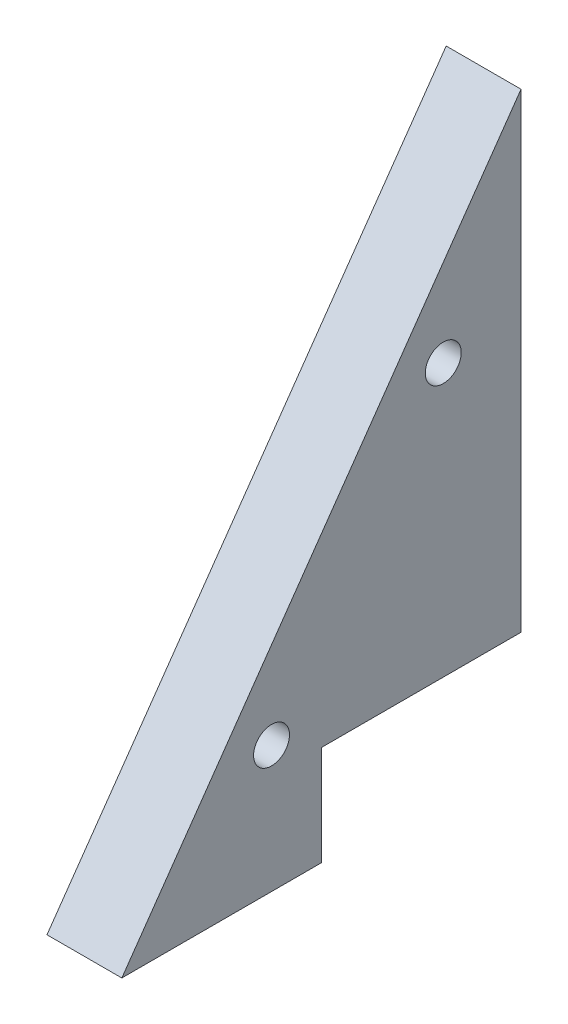
ISO-10303-21;
HEADER;
FILE_DESCRIPTION(('STEP AP214'),'2;1');
FILE_NAME('part.step','',(''),(''),'','','');
FILE_SCHEMA(('AUTOMOTIVE_DESIGN { 1 0 10303 214 1 1 1 1 }'));
ENDSEC;
DATA;
#1=APPLICATION_CONTEXT('core data for automotive mechanical design processes');
#2=APPLICATION_PROTOCOL_DEFINITION('international standard','automotive_design',2000,#1);
#3=PRODUCT_CONTEXT('',#1,'mechanical');
#4=PRODUCT('Part','Part','',(#3));
#5=PRODUCT_RELATED_PRODUCT_CATEGORY('part','',(#4));
#6=PRODUCT_DEFINITION_FORMATION('','',#4);
#7=PRODUCT_DEFINITION_CONTEXT('part definition',#1,'design');
#8=PRODUCT_DEFINITION('design','',#6,#7);
#9=PRODUCT_DEFINITION_SHAPE('','',#8);
#10=(LENGTH_UNIT() NAMED_UNIT(*) SI_UNIT(.MILLI.,.METRE.));
#11=(NAMED_UNIT(*) PLANE_ANGLE_UNIT() SI_UNIT($,.RADIAN.));
#12=(NAMED_UNIT(*) SI_UNIT($,.STERADIAN.) SOLID_ANGLE_UNIT());
#13=UNCERTAINTY_MEASURE_WITH_UNIT(LENGTH_MEASURE(1.E-05),#10,'distance_accuracy_value','');
#14=(GEOMETRIC_REPRESENTATION_CONTEXT(3) GLOBAL_UNCERTAINTY_ASSIGNED_CONTEXT((#13)) GLOBAL_UNIT_ASSIGNED_CONTEXT((#10,
#11,#12)) REPRESENTATION_CONTEXT('',''));
#15=CARTESIAN_POINT('',(0.,0.,0.));
#16=DIRECTION('',(0.,0.,1.));
#17=DIRECTION('',(1.,0.,0.));
#18=AXIS2_PLACEMENT_3D('',#15,#16,#17);
#19=CARTESIAN_POINT('',(9.525,12.7,0.));
#20=DIRECTION('',(0.,0.,1.));
#21=DIRECTION('',(1.,0.,0.));
#22=AXIS2_PLACEMENT_3D('',#19,#20,#21);
#23=PLANE('',#22);
#24=DIRECTION('',(0.,1.,0.));
#25=VECTOR('',#24,1.);
#26=CARTESIAN_POINT('',(0.,12.7,0.));
#27=LINE('',#26,#25);
#28=CARTESIAN_POINT('',(0.,0.,0.));
#29=VERTEX_POINT('',#28);
#30=CARTESIAN_POINT('',(0.,12.7,0.));
#31=VERTEX_POINT('',#30);
#32=EDGE_CURVE('E123',#29,#31,#27,.T.);
#33=ORIENTED_EDGE('',*,*,#32,.T.);
#34=DIRECTION('',(-1.,0.,0.));
#35=VECTOR('',#34,1.);
#36=CARTESIAN_POINT('',(9.525,12.7,0.));
#37=LINE('',#36,#35);
#38=CARTESIAN_POINT('',(9.525,12.7,0.));
#39=VERTEX_POINT('',#38);
#40=EDGE_CURVE('E11',#39,#31,#37,.T.);
#41=ORIENTED_EDGE('',*,*,#40,.F.);
#42=DIRECTION('',(0.,1.,0.));
#43=VECTOR('',#42,1.);
#44=CARTESIAN_POINT('',(9.525,12.7,0.));
#45=LINE('',#44,#43);
#46=CARTESIAN_POINT('',(9.525,0.,0.));
#47=VERTEX_POINT('',#46);
#48=EDGE_CURVE('E137',#47,#39,#45,.T.);
#49=ORIENTED_EDGE('',*,*,#48,.F.);
#50=DIRECTION('',(-1.,0.,0.));
#51=VECTOR('',#50,1.);
#52=CARTESIAN_POINT('',(9.525,0.,0.));
#53=LINE('',#52,#51);
#54=EDGE_CURVE('E119',#47,#29,#53,.T.);
#55=ORIENTED_EDGE('',*,*,#54,.T.);
#56=EDGE_LOOP('',(#33,#41,#49,#55));
#57=FACE_BOUND('',#56,.T.);
#58=ADVANCED_FACE('F44',(#57),#23,.F.);
#59=CARTESIAN_POINT('',(9.525,12.7,-25.4));
#60=DIRECTION('',(0.,1.,0.));
#61=DIRECTION('',(0.,0.,1.));
#62=AXIS2_PLACEMENT_3D('',#59,#60,#61);
#63=PLANE('',#62);
#64=CARTESIAN_POINT('',(4.7625,12.7,-19.05));
#65=DIRECTION('',(0.,-1.,0.));
#66=DIRECTION('',(0.,0.,-1.));
#67=AXIS2_PLACEMENT_3D('',#64,#65,#66);
#68=CIRCLE('',#67,1.905);
#69=CARTESIAN_POINT('',(4.7625,12.7,-20.955));
#70=VERTEX_POINT('',#69);
#71=EDGE_CURVE('E173',#70,#70,#68,.T.);
#72=ORIENTED_EDGE('',*,*,#71,.F.);
#73=EDGE_LOOP('',(#72));
#74=FACE_BOUND('',#73,.T.);
#75=CARTESIAN_POINT('',(4.7625,12.7,-6.35));
#76=DIRECTION('',(0.,-1.,0.));
#77=DIRECTION('',(0.,0.,-1.));
#78=AXIS2_PLACEMENT_3D('',#75,#76,#77);
#79=CIRCLE('',#78,1.905);
#80=CARTESIAN_POINT('',(4.7625,12.7,-8.255));
#81=VERTEX_POINT('',#80);
#82=EDGE_CURVE('E176',#81,#81,#79,.T.);
#83=ORIENTED_EDGE('',*,*,#82,.F.);
#84=EDGE_LOOP('',(#83));
#85=FACE_BOUND('',#84,.T.);
#86=DIRECTION('',(0.,0.,-1.));
#87=VECTOR('',#86,1.);
#88=CARTESIAN_POINT('',(0.,12.7,-25.4));
#89=LINE('',#88,#87);
#90=CARTESIAN_POINT('',(0.,12.7,-25.4));
#91=VERTEX_POINT('',#90);
#92=EDGE_CURVE('E127',#31,#91,#89,.T.);
#93=ORIENTED_EDGE('',*,*,#92,.T.);
#94=DIRECTION('',(-1.,0.,0.));
#95=VECTOR('',#94,1.);
#96=CARTESIAN_POINT('',(9.525,12.7,-25.4));
#97=LINE('',#96,#95);
#98=CARTESIAN_POINT('',(9.525,12.7,-25.4));
#99=VERTEX_POINT('',#98);
#100=EDGE_CURVE('E53',#99,#91,#97,.T.);
#101=ORIENTED_EDGE('',*,*,#100,.F.);
#102=DIRECTION('',(0.,0.,-1.));
#103=VECTOR('',#102,1.);
#104=CARTESIAN_POINT('',(9.525,12.7,-25.4));
#105=LINE('',#104,#103);
#106=EDGE_CURVE('E95',#39,#99,#105,.T.);
#107=ORIENTED_EDGE('',*,*,#106,.F.);
#108=ORIENTED_EDGE('',*,*,#40,.T.);
#109=EDGE_LOOP('',(#93,#101,#107,#108));
#110=FACE_BOUND('',#109,.T.);
#111=ADVANCED_FACE('F161',(#74,#85,#110),#63,.F.);
#112=CARTESIAN_POINT('',(9.525,72.5499187424986,-25.4));
#113=DIRECTION('',(0.,0.,1.));
#114=DIRECTION('',(0.,-1.,0.));
#115=AXIS2_PLACEMENT_3D('',#112,#113,#114);
#116=PLANE('',#115);
#117=DIRECTION('',(0.,1.,0.));
#118=VECTOR('',#117,1.);
#119=CARTESIAN_POINT('',(0.,72.5499187424986,-25.4));
#120=LINE('',#119,#118);
#121=CARTESIAN_POINT('',(0.,72.5499187424986,-25.4));
#122=VERTEX_POINT('',#121);
#123=EDGE_CURVE('E111',#91,#122,#120,.T.);
#124=ORIENTED_EDGE('',*,*,#123,.T.);
#125=DIRECTION('',(-1.,0.,0.));
#126=VECTOR('',#125,1.);
#127=CARTESIAN_POINT('',(9.525,72.5499187424986,-25.4));
#128=LINE('',#127,#126);
#129=CARTESIAN_POINT('',(9.525,72.5499187424986,-25.4));
#130=VERTEX_POINT('',#129);
#131=EDGE_CURVE('E108',#130,#122,#128,.T.);
#132=ORIENTED_EDGE('',*,*,#131,.F.);
#133=DIRECTION('',(0.,1.,0.));
#134=VECTOR('',#133,1.);
#135=CARTESIAN_POINT('',(9.525,72.5499187424986,-25.4));
#136=LINE('',#135,#134);
#137=EDGE_CURVE('E99',#99,#130,#136,.T.);
#138=ORIENTED_EDGE('',*,*,#137,.F.);
#139=ORIENTED_EDGE('',*,*,#100,.T.);
#140=EDGE_LOOP('',(#124,#132,#138,#139));
#141=FACE_BOUND('',#140,.T.);
#142=ADVANCED_FACE('F109',(#141),#116,.F.);
#143=CARTESIAN_POINT('',(9.525,0.,25.4));
#144=DIRECTION('',(0.,-0.57357643635105,-0.819152044288989));
#145=DIRECTION('',(0.,0.819152044288989,-0.57357643635105));
#146=AXIS2_PLACEMENT_3D('',#143,#144,#145);
#147=PLANE('',#146);
#148=DIRECTION('',(0.,-0.819152044288989,0.57357643635105));
#149=VECTOR('',#148,1.);
#150=CARTESIAN_POINT('',(0.,0.,25.4));
#151=LINE('',#150,#149);
#152=CARTESIAN_POINT('',(0.,0.,25.4));
#153=VERTEX_POINT('',#152);
#154=EDGE_CURVE('E81',#122,#153,#151,.T.);
#155=ORIENTED_EDGE('',*,*,#154,.T.);
#156=DIRECTION('',(-1.,0.,0.));
#157=VECTOR('',#156,1.);
#158=CARTESIAN_POINT('',(9.525,0.,25.4));
#159=LINE('',#158,#157);
#160=CARTESIAN_POINT('',(9.525,0.,25.4));
#161=VERTEX_POINT('',#160);
#162=EDGE_CURVE('E113',#161,#153,#159,.T.);
#163=ORIENTED_EDGE('',*,*,#162,.F.);
#164=DIRECTION('',(0.,-0.819152044288989,0.57357643635105));
#165=VECTOR('',#164,1.);
#166=CARTESIAN_POINT('',(9.525,0.,25.4));
#167=LINE('',#166,#165);
#168=EDGE_CURVE('E103',#130,#161,#167,.T.);
#169=ORIENTED_EDGE('',*,*,#168,.F.);
#170=ORIENTED_EDGE('',*,*,#131,.T.);
#171=EDGE_LOOP('',(#155,#163,#169,#170));
#172=FACE_BOUND('',#171,.T.);
#173=ADVANCED_FACE('F115',(#172),#147,.F.);
#174=CARTESIAN_POINT('',(9.525,0.,0.));
#175=DIRECTION('',(0.,1.,0.));
#176=DIRECTION('',(0.,0.,1.));
#177=AXIS2_PLACEMENT_3D('',#174,#175,#176);
#178=PLANE('',#177);
#179=DIRECTION('',(0.,0.,-1.));
#180=VECTOR('',#179,1.);
#181=CARTESIAN_POINT('',(0.,0.,0.));
#182=LINE('',#181,#180);
#183=EDGE_CURVE('E87',#153,#29,#182,.T.);
#184=ORIENTED_EDGE('',*,*,#183,.T.);
#185=ORIENTED_EDGE('',*,*,#54,.F.);
#186=DIRECTION('',(0.,0.,-1.));
#187=VECTOR('',#186,1.);
#188=CARTESIAN_POINT('',(9.525,0.,0.));
#189=LINE('',#188,#187);
#190=EDGE_CURVE('E61',#161,#47,#189,.T.);
#191=ORIENTED_EDGE('',*,*,#190,.F.);
#192=ORIENTED_EDGE('',*,*,#162,.T.);
#193=EDGE_LOOP('',(#184,#185,#191,#192));
#194=FACE_BOUND('',#193,.T.);
#195=ADVANCED_FACE('F148',(#194),#178,.F.);
#196=CARTESIAN_POINT('',(9.525,0.,0.));
#197=DIRECTION('',(-1.,0.,0.));
#198=DIRECTION('',(0.,0.,1.));
#199=AXIS2_PLACEMENT_3D('',#196,#197,#198);
#200=PLANE('',#199);
#201=CARTESIAN_POINT('',(9.525,16.1353323762431,6.35));
#202=DIRECTION('',(1.,0.,0.));
#203=DIRECTION('',(0.,0.,-1.));
#204=AXIS2_PLACEMENT_3D('',#201,#202,#203);
#205=CIRCLE('',#204,2.286);
#206=CARTESIAN_POINT('',(9.525,16.1353323762431,4.064));
#207=VERTEX_POINT('',#206);
#208=EDGE_CURVE('E204',#207,#207,#205,.T.);
#209=ORIENTED_EDGE('',*,*,#208,.F.);
#210=EDGE_LOOP('',(#209));
#211=FACE_BOUND('',#210,.T.);
#212=CARTESIAN_POINT('',(9.525,47.3450252636536,-15.503262224975));
#213=DIRECTION('',(1.,0.,0.));
#214=DIRECTION('',(0.,0.,-1.));
#215=AXIS2_PLACEMENT_3D('',#212,#213,#214);
#216=CIRCLE('',#215,2.286);
#217=CARTESIAN_POINT('',(9.525,47.3450252636536,-17.789262224975));
#218=VERTEX_POINT('',#217);
#219=EDGE_CURVE('E200',#218,#218,#216,.T.);
#220=ORIENTED_EDGE('',*,*,#219,.F.);
#221=EDGE_LOOP('',(#220));
#222=FACE_BOUND('',#221,.T.);
#223=ORIENTED_EDGE('',*,*,#48,.T.);
#224=ORIENTED_EDGE('',*,*,#106,.T.);
#225=ORIENTED_EDGE('',*,*,#137,.T.);
#226=ORIENTED_EDGE('',*,*,#168,.T.);
#227=ORIENTED_EDGE('',*,*,#190,.T.);
#228=EDGE_LOOP('',(#223,#224,#225,#226,#227));
#229=FACE_BOUND('',#228,.T.);
#230=ADVANCED_FACE('F101',(#211,#222,#229),#200,.F.);
#231=CARTESIAN_POINT('',(0.,0.,0.));
#232=DIRECTION('',(-1.,0.,0.));
#233=DIRECTION('',(0.,0.,1.));
#234=AXIS2_PLACEMENT_3D('',#231,#232,#233);
#235=PLANE('',#234);
#236=CARTESIAN_POINT('',(0.,16.1353323762431,6.35));
#237=DIRECTION('',(1.,0.,0.));
#238=DIRECTION('',(0.,0.,-1.));
#239=AXIS2_PLACEMENT_3D('',#236,#237,#238);
#240=CIRCLE('',#239,2.286);
#241=CARTESIAN_POINT('',(0.,16.1353323762431,4.064));
#242=VERTEX_POINT('',#241);
#243=EDGE_CURVE('E185',#242,#242,#240,.T.);
#244=ORIENTED_EDGE('',*,*,#243,.T.);
#245=EDGE_LOOP('',(#244));
#246=FACE_BOUND('',#245,.T.);
#247=CARTESIAN_POINT('',(0.,47.3450252636536,-15.503262224975));
#248=DIRECTION('',(1.,0.,0.));
#249=DIRECTION('',(0.,0.,-1.));
#250=AXIS2_PLACEMENT_3D('',#247,#248,#249);
#251=CIRCLE('',#250,2.286);
#252=CARTESIAN_POINT('',(0.,47.3450252636536,-17.789262224975));
#253=VERTEX_POINT('',#252);
#254=EDGE_CURVE('E196',#253,#253,#251,.T.);
#255=ORIENTED_EDGE('',*,*,#254,.T.);
#256=EDGE_LOOP('',(#255));
#257=FACE_BOUND('',#256,.T.);
#258=ORIENTED_EDGE('',*,*,#32,.F.);
#259=ORIENTED_EDGE('',*,*,#183,.F.);
#260=ORIENTED_EDGE('',*,*,#154,.F.);
#261=ORIENTED_EDGE('',*,*,#123,.F.);
#262=ORIENTED_EDGE('',*,*,#92,.F.);
#263=EDGE_LOOP('',(#258,#259,#260,#261,#262));
#264=FACE_BOUND('',#263,.T.);
#265=ADVANCED_FACE('F144',(#246,#257,#264),#235,.T.);
#266=CARTESIAN_POINT('',(4.7625,22.225,-6.35));
#267=DIRECTION('',(0.,-1.,0.));
#268=DIRECTION('',(0.,0.,-1.));
#269=AXIS2_PLACEMENT_3D('',#266,#267,#268);
#270=CYLINDRICAL_SURFACE('',#269,1.905);
#271=CARTESIAN_POINT('',(4.7625,22.225,-6.35));
#272=DIRECTION('',(0.,-1.,0.));
#273=DIRECTION('',(0.,0.,-1.));
#274=AXIS2_PLACEMENT_3D('',#271,#272,#273);
#275=CIRCLE('',#274,1.905);
#276=CARTESIAN_POINT('',(4.7625,22.225,-8.255));
#277=VERTEX_POINT('',#276);
#278=EDGE_CURVE('E179',#277,#277,#275,.T.);
#279=CARTESIAN_POINT('',(4.7625,22.225,-8.255));
#280=CARTESIAN_POINT('',(4.7625,22.12578125,-8.255));
#281=CARTESIAN_POINT('',(4.7625,22.0265625,-8.255));
#282=CARTESIAN_POINT('',(4.7625,21.828125,-8.255));
#283=CARTESIAN_POINT('',(4.7625,21.72890625,-8.255));
#284=CARTESIAN_POINT('',(4.7625,21.53046875,-8.255));
#285=CARTESIAN_POINT('',(4.7625,21.43125,-8.255));
#286=CARTESIAN_POINT('',(4.7625,21.2328125,-8.255));
#287=CARTESIAN_POINT('',(4.7625,21.13359375,-8.255));
#288=CARTESIAN_POINT('',(4.7625,20.93515625,-8.255));
#289=CARTESIAN_POINT('',(4.7625,20.8359375,-8.255));
#290=CARTESIAN_POINT('',(4.7625,20.6375,-8.255));
#291=CARTESIAN_POINT('',(4.7625,20.53828125,-8.255));
#292=CARTESIAN_POINT('',(4.7625,20.33984375,-8.255));
#293=CARTESIAN_POINT('',(4.7625,20.240625,-8.255));
#294=CARTESIAN_POINT('',(4.7625,20.0421875,-8.255));
#295=CARTESIAN_POINT('',(4.7625,19.94296875,-8.255));
#296=CARTESIAN_POINT('',(4.7625,19.74453125,-8.255));
#297=CARTESIAN_POINT('',(4.7625,19.6453125,-8.255));
#298=CARTESIAN_POINT('',(4.7625,19.446875,-8.255));
#299=CARTESIAN_POINT('',(4.7625,19.34765625,-8.255));
#300=CARTESIAN_POINT('',(4.7625,19.14921875,-8.255));
#301=CARTESIAN_POINT('',(4.7625,19.05,-8.255));
#302=CARTESIAN_POINT('',(4.7625,18.8515625,-8.255));
#303=CARTESIAN_POINT('',(4.7625,18.75234375,-8.255));
#304=CARTESIAN_POINT('',(4.7625,18.55390625,-8.255));
#305=CARTESIAN_POINT('',(4.7625,18.4546875,-8.255));
#306=CARTESIAN_POINT('',(4.7625,18.25625,-8.255));
#307=CARTESIAN_POINT('',(4.7625,18.15703125,-8.255));
#308=CARTESIAN_POINT('',(4.7625,17.95859375,-8.255));
#309=CARTESIAN_POINT('',(4.7625,17.859375,-8.255));
#310=CARTESIAN_POINT('',(4.7625,17.6609375,-8.255));
#311=CARTESIAN_POINT('',(4.7625,17.56171875,-8.255));
#312=CARTESIAN_POINT('',(4.7625,17.36328125,-8.255));
#313=CARTESIAN_POINT('',(4.7625,17.2640625,-8.255));
#314=CARTESIAN_POINT('',(4.7625,17.065625,-8.255));
#315=CARTESIAN_POINT('',(4.7625,16.96640625,-8.255));
#316=CARTESIAN_POINT('',(4.7625,16.76796875,-8.255));
#317=CARTESIAN_POINT('',(4.7625,16.66875,-8.255));
#318=CARTESIAN_POINT('',(4.7625,16.4703125,-8.255));
#319=CARTESIAN_POINT('',(4.7625,16.37109375,-8.255));
#320=CARTESIAN_POINT('',(4.7625,16.17265625,-8.255));
#321=CARTESIAN_POINT('',(4.7625,16.0734375,-8.255));
#322=CARTESIAN_POINT('',(4.7625,15.875,-8.255));
#323=CARTESIAN_POINT('',(4.7625,15.77578125,-8.255));
#324=CARTESIAN_POINT('',(4.7625,15.57734375,-8.255));
#325=CARTESIAN_POINT('',(4.7625,15.478125,-8.255));
#326=CARTESIAN_POINT('',(4.7625,15.2796875,-8.255));
#327=CARTESIAN_POINT('',(4.7625,15.18046875,-8.255));
#328=CARTESIAN_POINT('',(4.7625,14.98203125,-8.255));
#329=CARTESIAN_POINT('',(4.7625,14.8828125,-8.255));
#330=CARTESIAN_POINT('',(4.7625,14.684375,-8.255));
#331=CARTESIAN_POINT('',(4.7625,14.58515625,-8.255));
#332=CARTESIAN_POINT('',(4.7625,14.38671875,-8.255));
#333=CARTESIAN_POINT('',(4.7625,14.2875,-8.255));
#334=CARTESIAN_POINT('',(4.7625,14.0890625,-8.255));
#335=CARTESIAN_POINT('',(4.7625,13.98984375,-8.255));
#336=CARTESIAN_POINT('',(4.7625,13.79140625,-8.255));
#337=CARTESIAN_POINT('',(4.7625,13.6921875,-8.255));
#338=CARTESIAN_POINT('',(4.7625,13.49375,-8.255));
#339=CARTESIAN_POINT('',(4.7625,13.39453125,-8.255));
#340=CARTESIAN_POINT('',(4.7625,13.19609375,-8.255));
#341=CARTESIAN_POINT('',(4.7625,13.096875,-8.255));
#342=CARTESIAN_POINT('',(4.7625,12.8984375,-8.255));
#343=CARTESIAN_POINT('',(4.7625,12.79921875,-8.255));
#344=CARTESIAN_POINT('',(4.7625,12.7,-8.255));
#345=B_SPLINE_CURVE_WITH_KNOTS('',3,(#279,#280,#281,#282,#283,#284,#285,#286,#287,#288,#289,
#290,#291,#292,#293,#294,#295,#296,#297,#298,#299,#300,#301,#302,#303,#304,#305,#306,#307,#308,
#309,#310,#311,#312,#313,#314,#315,#316,#317,#318,#319,#320,#321,#322,#323,#324,#325,#326,#327,
#328,#329,#330,#331,#332,#333,#334,#335,#336,#337,#338,#339,#340,#341,#342,#343,#344),
.UNSPECIFIED.,.F.,.F.,(4,2,2,2,2,2,2,2,2,2,2,2,2,2,2,2,2,2,2,2,2,2,2,2,2,2,2,2,2,2,2,2,4),(0.,
0.29765625,0.5953125,0.892968750000001,1.190625,1.48828125,1.7859375,2.08359375,2.38125,
2.67890625,2.9765625,3.27421875,3.571875,3.86953125,4.1671875,4.46484375,4.7625,5.06015625,
5.3578125,5.65546875,5.953125,6.25078125,6.5484375,6.84609375,7.14375,7.44140625,7.7390625,
8.03671875,8.334375,8.63203125,8.9296875,9.22734375,9.525),.UNSPECIFIED.);
#346=EDGE_CURVE('BSEAM239',#277,#81,#345,.T.);
#347=ORIENTED_EDGE('',*,*,#278,.F.);
#348=ORIENTED_EDGE('',*,*,#82,.T.);
#349=ORIENTED_EDGE('',*,*,#346,.T.);
#350=ORIENTED_EDGE('',*,*,#346,.F.);
#351=EDGE_LOOP('',(#347,#349,#348,#350));
#352=FACE_BOUND('',#351,.T.);
#353=ADVANCED_FACE('F239',(#352),#270,.F.);
#354=CARTESIAN_POINT('',(4.7625,22.225,-6.35));
#355=DIRECTION('',(0.,-1.,0.));
#356=DIRECTION('',(0.,0.,-1.));
#357=AXIS2_PLACEMENT_3D('',#354,#355,#356);
#358=PLANE('',#357);
#359=ORIENTED_EDGE('',*,*,#278,.T.);
#360=EDGE_LOOP('',(#359));
#361=FACE_BOUND('',#360,.T.);
#362=ADVANCED_FACE('F237',(#361),#358,.T.);
#363=CARTESIAN_POINT('',(4.7625,22.225,-19.05));
#364=DIRECTION('',(0.,-1.,0.));
#365=DIRECTION('',(0.,0.,-1.));
#366=AXIS2_PLACEMENT_3D('',#363,#364,#365);
#367=CYLINDRICAL_SURFACE('',#366,1.905);
#368=CARTESIAN_POINT('',(4.7625,22.225,-19.05));
#369=DIRECTION('',(0.,-1.,0.));
#370=DIRECTION('',(0.,0.,-1.));
#371=AXIS2_PLACEMENT_3D('',#368,#369,#370);
#372=CIRCLE('',#371,1.905);
#373=CARTESIAN_POINT('',(4.7625,22.225,-20.955));
#374=VERTEX_POINT('',#373);
#375=EDGE_CURVE('E128',#374,#374,#372,.T.);
#376=CARTESIAN_POINT('',(4.7625,22.225,-20.955));
#377=CARTESIAN_POINT('',(4.7625,22.12578125,-20.955));
#378=CARTESIAN_POINT('',(4.7625,22.0265625,-20.955));
#379=CARTESIAN_POINT('',(4.7625,21.828125,-20.955));
#380=CARTESIAN_POINT('',(4.7625,21.72890625,-20.955));
#381=CARTESIAN_POINT('',(4.7625,21.53046875,-20.955));
#382=CARTESIAN_POINT('',(4.7625,21.43125,-20.955));
#383=CARTESIAN_POINT('',(4.7625,21.2328125,-20.955));
#384=CARTESIAN_POINT('',(4.7625,21.13359375,-20.955));
#385=CARTESIAN_POINT('',(4.7625,20.93515625,-20.955));
#386=CARTESIAN_POINT('',(4.7625,20.8359375,-20.955));
#387=CARTESIAN_POINT('',(4.7625,20.6375,-20.955));
#388=CARTESIAN_POINT('',(4.7625,20.53828125,-20.955));
#389=CARTESIAN_POINT('',(4.7625,20.33984375,-20.955));
#390=CARTESIAN_POINT('',(4.7625,20.240625,-20.955));
#391=CARTESIAN_POINT('',(4.7625,20.0421875,-20.955));
#392=CARTESIAN_POINT('',(4.7625,19.94296875,-20.955));
#393=CARTESIAN_POINT('',(4.7625,19.74453125,-20.955));
#394=CARTESIAN_POINT('',(4.7625,19.6453125,-20.955));
#395=CARTESIAN_POINT('',(4.7625,19.446875,-20.955));
#396=CARTESIAN_POINT('',(4.7625,19.34765625,-20.955));
#397=CARTESIAN_POINT('',(4.7625,19.14921875,-20.955));
#398=CARTESIAN_POINT('',(4.7625,19.05,-20.955));
#399=CARTESIAN_POINT('',(4.7625,18.8515625,-20.955));
#400=CARTESIAN_POINT('',(4.7625,18.75234375,-20.955));
#401=CARTESIAN_POINT('',(4.7625,18.55390625,-20.955));
#402=CARTESIAN_POINT('',(4.7625,18.4546875,-20.955));
#403=CARTESIAN_POINT('',(4.7625,18.25625,-20.955));
#404=CARTESIAN_POINT('',(4.7625,18.15703125,-20.955));
#405=CARTESIAN_POINT('',(4.7625,17.95859375,-20.955));
#406=CARTESIAN_POINT('',(4.7625,17.859375,-20.955));
#407=CARTESIAN_POINT('',(4.7625,17.6609375,-20.955));
#408=CARTESIAN_POINT('',(4.7625,17.56171875,-20.955));
#409=CARTESIAN_POINT('',(4.7625,17.36328125,-20.955));
#410=CARTESIAN_POINT('',(4.7625,17.2640625,-20.955));
#411=CARTESIAN_POINT('',(4.7625,17.065625,-20.955));
#412=CARTESIAN_POINT('',(4.7625,16.96640625,-20.955));
#413=CARTESIAN_POINT('',(4.7625,16.76796875,-20.955));
#414=CARTESIAN_POINT('',(4.7625,16.66875,-20.955));
#415=CARTESIAN_POINT('',(4.7625,16.4703125,-20.955));
#416=CARTESIAN_POINT('',(4.7625,16.37109375,-20.955));
#417=CARTESIAN_POINT('',(4.7625,16.17265625,-20.955));
#418=CARTESIAN_POINT('',(4.7625,16.0734375,-20.955));
#419=CARTESIAN_POINT('',(4.7625,15.875,-20.955));
#420=CARTESIAN_POINT('',(4.7625,15.77578125,-20.955));
#421=CARTESIAN_POINT('',(4.7625,15.57734375,-20.955));
#422=CARTESIAN_POINT('',(4.7625,15.478125,-20.955));
#423=CARTESIAN_POINT('',(4.7625,15.2796875,-20.955));
#424=CARTESIAN_POINT('',(4.7625,15.18046875,-20.955));
#425=CARTESIAN_POINT('',(4.7625,14.98203125,-20.955));
#426=CARTESIAN_POINT('',(4.7625,14.8828125,-20.955));
#427=CARTESIAN_POINT('',(4.7625,14.684375,-20.955));
#428=CARTESIAN_POINT('',(4.7625,14.58515625,-20.955));
#429=CARTESIAN_POINT('',(4.7625,14.38671875,-20.955));
#430=CARTESIAN_POINT('',(4.7625,14.2875,-20.955));
#431=CARTESIAN_POINT('',(4.7625,14.0890625,-20.955));
#432=CARTESIAN_POINT('',(4.7625,13.98984375,-20.955));
#433=CARTESIAN_POINT('',(4.7625,13.79140625,-20.955));
#434=CARTESIAN_POINT('',(4.7625,13.6921875,-20.955));
#435=CARTESIAN_POINT('',(4.7625,13.49375,-20.955));
#436=CARTESIAN_POINT('',(4.7625,13.39453125,-20.955));
#437=CARTESIAN_POINT('',(4.7625,13.19609375,-20.955));
#438=CARTESIAN_POINT('',(4.7625,13.096875,-20.955));
#439=CARTESIAN_POINT('',(4.7625,12.8984375,-20.955));
#440=CARTESIAN_POINT('',(4.7625,12.79921875,-20.955));
#441=CARTESIAN_POINT('',(4.7625,12.7,-20.955));
#442=B_SPLINE_CURVE_WITH_KNOTS('',3,(#376,#377,#378,#379,#380,#381,#382,#383,#384,#385,#386,
#387,#388,#389,#390,#391,#392,#393,#394,#395,#396,#397,#398,#399,#400,#401,#402,#403,#404,#405,
#406,#407,#408,#409,#410,#411,#412,#413,#414,#415,#416,#417,#418,#419,#420,#421,#422,#423,#424,
#425,#426,#427,#428,#429,#430,#431,#432,#433,#434,#435,#436,#437,#438,#439,#440,#441),
.UNSPECIFIED.,.F.,.F.,(4,2,2,2,2,2,2,2,2,2,2,2,2,2,2,2,2,2,2,2,2,2,2,2,2,2,2,2,2,2,2,2,4),(0.,
0.29765625,0.5953125,0.892968750000001,1.190625,1.48828125,1.7859375,2.08359375,2.38125,
2.67890625,2.9765625,3.27421875,3.571875,3.86953125,4.1671875,4.46484375,4.7625,5.06015625,
5.3578125,5.65546875,5.953125,6.25078125,6.5484375,6.84609375,7.14375,7.44140625,7.7390625,
8.03671875,8.334375,8.63203125,8.9296875,9.22734375,9.525),.UNSPECIFIED.);
#443=EDGE_CURVE('BSEAM231',#374,#70,#442,.T.);
#444=ORIENTED_EDGE('',*,*,#375,.F.);
#445=ORIENTED_EDGE('',*,*,#71,.T.);
#446=ORIENTED_EDGE('',*,*,#443,.T.);
#447=ORIENTED_EDGE('',*,*,#443,.F.);
#448=EDGE_LOOP('',(#444,#446,#445,#447));
#449=FACE_BOUND('',#448,.T.);
#450=ADVANCED_FACE('F231',(#449),#367,.F.);
#451=CARTESIAN_POINT('',(4.7625,22.225,-19.05));
#452=DIRECTION('',(0.,-1.,0.));
#453=DIRECTION('',(0.,0.,-1.));
#454=AXIS2_PLACEMENT_3D('',#451,#452,#453);
#455=PLANE('',#454);
#456=ORIENTED_EDGE('',*,*,#375,.T.);
#457=EDGE_LOOP('',(#456));
#458=FACE_BOUND('',#457,.T.);
#459=ADVANCED_FACE('F224',(#458),#455,.T.);
#460=CARTESIAN_POINT('',(0.,47.3450252636536,-15.503262224975));
#461=DIRECTION('',(1.,0.,0.));
#462=DIRECTION('',(0.,0.,-1.));
#463=AXIS2_PLACEMENT_3D('',#460,#461,#462);
#464=CYLINDRICAL_SURFACE('',#463,2.286);
#465=CARTESIAN_POINT('',(0.,47.3450252636536,-17.789262224975));
#466=CARTESIAN_POINT('',(0.0992187499999999,47.3450252636536,-17.789262224975));
#467=CARTESIAN_POINT('',(0.1984375,47.3450252636536,-17.789262224975));
#468=CARTESIAN_POINT('',(0.396875,47.3450252636536,-17.789262224975));
#469=CARTESIAN_POINT('',(0.49609375,47.3450252636536,-17.789262224975));
#470=CARTESIAN_POINT('',(0.69453125,47.3450252636536,-17.789262224975));
#471=CARTESIAN_POINT('',(0.79375,47.3450252636536,-17.789262224975));
#472=CARTESIAN_POINT('',(0.9921875,47.3450252636536,-17.789262224975));
#473=CARTESIAN_POINT('',(1.09140625,47.3450252636536,-17.789262224975));
#474=CARTESIAN_POINT('',(1.28984375,47.3450252636536,-17.789262224975));
#475=CARTESIAN_POINT('',(1.3890625,47.3450252636536,-17.789262224975));
#476=CARTESIAN_POINT('',(1.5875,47.3450252636536,-17.789262224975));
#477=CARTESIAN_POINT('',(1.68671875,47.3450252636536,-17.789262224975));
#478=CARTESIAN_POINT('',(1.88515625,47.3450252636536,-17.789262224975));
#479=CARTESIAN_POINT('',(1.984375,47.3450252636536,-17.789262224975));
#480=CARTESIAN_POINT('',(2.1828125,47.3450252636536,-17.789262224975));
#481=CARTESIAN_POINT('',(2.28203125,47.3450252636536,-17.789262224975));
#482=CARTESIAN_POINT('',(2.48046875,47.3450252636536,-17.789262224975));
#483=CARTESIAN_POINT('',(2.5796875,47.3450252636536,-17.789262224975));
#484=CARTESIAN_POINT('',(2.778125,47.3450252636536,-17.789262224975));
#485=CARTESIAN_POINT('',(2.87734375,47.3450252636536,-17.789262224975));
#486=CARTESIAN_POINT('',(3.07578125,47.3450252636536,-17.789262224975));
#487=CARTESIAN_POINT('',(3.175,47.3450252636536,-17.789262224975));
#488=CARTESIAN_POINT('',(3.3734375,47.3450252636536,-17.789262224975));
#489=CARTESIAN_POINT('',(3.47265625,47.3450252636536,-17.789262224975));
#490=CARTESIAN_POINT('',(3.67109375,47.3450252636536,-17.789262224975));
#491=CARTESIAN_POINT('',(3.7703125,47.3450252636536,-17.789262224975));
#492=CARTESIAN_POINT('',(3.96875,47.3450252636536,-17.789262224975));
#493=CARTESIAN_POINT('',(4.06796875,47.3450252636536,-17.789262224975));
#494=CARTESIAN_POINT('',(4.26640625,47.3450252636536,-17.789262224975));
#495=CARTESIAN_POINT('',(4.365625,47.3450252636536,-17.789262224975));
#496=CARTESIAN_POINT('',(4.5640625,47.3450252636536,-17.789262224975));
#497=CARTESIAN_POINT('',(4.66328125,47.3450252636536,-17.789262224975));
#498=CARTESIAN_POINT('',(4.86171875,47.3450252636536,-17.789262224975));
#499=CARTESIAN_POINT('',(4.9609375,47.3450252636536,-17.789262224975));
#500=CARTESIAN_POINT('',(5.159375,47.3450252636536,-17.789262224975));
#501=CARTESIAN_POINT('',(5.25859375,47.3450252636536,-17.789262224975));
#502=CARTESIAN_POINT('',(5.45703125,47.3450252636536,-17.789262224975));
#503=CARTESIAN_POINT('',(5.55625,47.3450252636536,-17.789262224975));
#504=CARTESIAN_POINT('',(5.7546875,47.3450252636536,-17.789262224975));
#505=CARTESIAN_POINT('',(5.85390625,47.3450252636536,-17.789262224975));
#506=CARTESIAN_POINT('',(6.05234375,47.3450252636536,-17.789262224975));
#507=CARTESIAN_POINT('',(6.1515625,47.3450252636536,-17.789262224975));
#508=CARTESIAN_POINT('',(6.35,47.3450252636536,-17.789262224975));
#509=CARTESIAN_POINT('',(6.44921875,47.3450252636536,-17.789262224975));
#510=CARTESIAN_POINT('',(6.64765625,47.3450252636536,-17.789262224975));
#511=CARTESIAN_POINT('',(6.746875,47.3450252636536,-17.789262224975));
#512=CARTESIAN_POINT('',(6.9453125,47.3450252636536,-17.789262224975));
#513=CARTESIAN_POINT('',(7.04453125,47.3450252636536,-17.789262224975));
#514=CARTESIAN_POINT('',(7.24296875,47.3450252636536,-17.789262224975));
#515=CARTESIAN_POINT('',(7.3421875,47.3450252636536,-17.789262224975));
#516=CARTESIAN_POINT('',(7.540625,47.3450252636536,-17.789262224975));
#517=CARTESIAN_POINT('',(7.63984375,47.3450252636536,-17.789262224975));
#518=CARTESIAN_POINT('',(7.83828125,47.3450252636536,-17.789262224975));
#519=CARTESIAN_POINT('',(7.9375,47.3450252636536,-17.789262224975));
#520=CARTESIAN_POINT('',(8.1359375,47.3450252636536,-17.789262224975));
#521=CARTESIAN_POINT('',(8.23515625,47.3450252636536,-17.789262224975));
#522=CARTESIAN_POINT('',(8.43359375,47.3450252636536,-17.789262224975));
#523=CARTESIAN_POINT('',(8.5328125,47.3450252636536,-17.789262224975));
#524=CARTESIAN_POINT('',(8.73125,47.3450252636536,-17.789262224975));
#525=CARTESIAN_POINT('',(8.83046875,47.3450252636536,-17.789262224975));
#526=CARTESIAN_POINT('',(9.02890625,47.3450252636536,-17.789262224975));
#527=CARTESIAN_POINT('',(9.128125,47.3450252636536,-17.789262224975));
#528=CARTESIAN_POINT('',(9.3265625,47.3450252636536,-17.789262224975));
#529=CARTESIAN_POINT('',(9.42578125,47.3450252636536,-17.789262224975));
#530=CARTESIAN_POINT('',(9.525,47.3450252636536,-17.789262224975));
#531=B_SPLINE_CURVE_WITH_KNOTS('',3,(#465,#466,#467,#468,#469,#470,#471,#472,#473,#474,#475,
#476,#477,#478,#479,#480,#481,#482,#483,#484,#485,#486,#487,#488,#489,#490,#491,#492,#493,#494,
#495,#496,#497,#498,#499,#500,#501,#502,#503,#504,#505,#506,#507,#508,#509,#510,#511,#512,#513,
#514,#515,#516,#517,#518,#519,#520,#521,#522,#523,#524,#525,#526,#527,#528,#529,#530),
.UNSPECIFIED.,.F.,.F.,(4,2,2,2,2,2,2,2,2,2,2,2,2,2,2,2,2,2,2,2,2,2,2,2,2,2,2,2,2,2,2,2,4),(0.,
0.29765625,0.5953125,0.89296875,1.190625,1.48828125,1.7859375,2.08359375,2.38125,2.67890625,
2.9765625,3.27421875,3.571875,3.86953125,4.1671875,4.46484375,4.7625,5.06015625,5.3578125,
5.65546875,5.953125,6.25078125,6.5484375,6.84609375,7.14375,7.44140625,7.7390625,8.03671875,
8.334375,8.63203125,8.9296875,9.22734375,9.525),.UNSPECIFIED.);
#532=EDGE_CURVE('BSEAM217',#253,#218,#531,.T.);
#533=ORIENTED_EDGE('',*,*,#254,.F.);
#534=ORIENTED_EDGE('',*,*,#219,.T.);
#535=ORIENTED_EDGE('',*,*,#532,.T.);
#536=ORIENTED_EDGE('',*,*,#532,.F.);
#537=EDGE_LOOP('',(#533,#535,#534,#536));
#538=FACE_BOUND('',#537,.T.);
#539=ADVANCED_FACE('F217',(#538),#464,.F.);
#540=CARTESIAN_POINT('',(0.,16.1353323762431,6.35));
#541=DIRECTION('',(1.,0.,0.));
#542=DIRECTION('',(0.,0.,-1.));
#543=AXIS2_PLACEMENT_3D('',#540,#541,#542);
#544=CYLINDRICAL_SURFACE('',#543,2.286);
#545=CARTESIAN_POINT('',(0.,16.1353323762431,4.064));
#546=CARTESIAN_POINT('',(0.0992187499999999,16.1353323762431,4.064));
#547=CARTESIAN_POINT('',(0.1984375,16.1353323762431,4.064));
#548=CARTESIAN_POINT('',(0.396875,16.1353323762431,4.064));
#549=CARTESIAN_POINT('',(0.49609375,16.1353323762431,4.064));
#550=CARTESIAN_POINT('',(0.69453125,16.1353323762431,4.064));
#551=CARTESIAN_POINT('',(0.79375,16.1353323762431,4.064));
#552=CARTESIAN_POINT('',(0.9921875,16.1353323762431,4.064));
#553=CARTESIAN_POINT('',(1.09140625,16.1353323762431,4.064));
#554=CARTESIAN_POINT('',(1.28984375,16.1353323762431,4.064));
#555=CARTESIAN_POINT('',(1.3890625,16.1353323762431,4.064));
#556=CARTESIAN_POINT('',(1.5875,16.1353323762431,4.064));
#557=CARTESIAN_POINT('',(1.68671875,16.1353323762431,4.064));
#558=CARTESIAN_POINT('',(1.88515625,16.1353323762431,4.064));
#559=CARTESIAN_POINT('',(1.984375,16.1353323762431,4.064));
#560=CARTESIAN_POINT('',(2.1828125,16.1353323762431,4.064));
#561=CARTESIAN_POINT('',(2.28203125,16.1353323762431,4.064));
#562=CARTESIAN_POINT('',(2.48046875,16.1353323762431,4.064));
#563=CARTESIAN_POINT('',(2.5796875,16.1353323762431,4.064));
#564=CARTESIAN_POINT('',(2.778125,16.1353323762431,4.064));
#565=CARTESIAN_POINT('',(2.87734375,16.1353323762431,4.064));
#566=CARTESIAN_POINT('',(3.07578125,16.1353323762431,4.064));
#567=CARTESIAN_POINT('',(3.175,16.1353323762431,4.064));
#568=CARTESIAN_POINT('',(3.3734375,16.1353323762431,4.064));
#569=CARTESIAN_POINT('',(3.47265625,16.1353323762431,4.064));
#570=CARTESIAN_POINT('',(3.67109375,16.1353323762431,4.064));
#571=CARTESIAN_POINT('',(3.7703125,16.1353323762431,4.064));
#572=CARTESIAN_POINT('',(3.96875,16.1353323762431,4.064));
#573=CARTESIAN_POINT('',(4.06796875,16.1353323762431,4.064));
#574=CARTESIAN_POINT('',(4.26640625,16.1353323762431,4.064));
#575=CARTESIAN_POINT('',(4.365625,16.1353323762431,4.064));
#576=CARTESIAN_POINT('',(4.5640625,16.1353323762431,4.064));
#577=CARTESIAN_POINT('',(4.66328125,16.1353323762431,4.064));
#578=CARTESIAN_POINT('',(4.86171875,16.1353323762431,4.064));
#579=CARTESIAN_POINT('',(4.9609375,16.1353323762431,4.064));
#580=CARTESIAN_POINT('',(5.159375,16.1353323762431,4.064));
#581=CARTESIAN_POINT('',(5.25859375,16.1353323762431,4.064));
#582=CARTESIAN_POINT('',(5.45703125,16.1353323762431,4.064));
#583=CARTESIAN_POINT('',(5.55625,16.1353323762431,4.064));
#584=CARTESIAN_POINT('',(5.7546875,16.1353323762431,4.064));
#585=CARTESIAN_POINT('',(5.85390625,16.1353323762431,4.064));
#586=CARTESIAN_POINT('',(6.05234375,16.1353323762431,4.064));
#587=CARTESIAN_POINT('',(6.1515625,16.1353323762431,4.064));
#588=CARTESIAN_POINT('',(6.35,16.1353323762431,4.064));
#589=CARTESIAN_POINT('',(6.44921875,16.1353323762431,4.064));
#590=CARTESIAN_POINT('',(6.64765625,16.1353323762431,4.064));
#591=CARTESIAN_POINT('',(6.746875,16.1353323762431,4.064));
#592=CARTESIAN_POINT('',(6.9453125,16.1353323762431,4.064));
#593=CARTESIAN_POINT('',(7.04453125,16.1353323762431,4.064));
#594=CARTESIAN_POINT('',(7.24296875,16.1353323762431,4.064));
#595=CARTESIAN_POINT('',(7.3421875,16.1353323762431,4.064));
#596=CARTESIAN_POINT('',(7.540625,16.1353323762431,4.064));
#597=CARTESIAN_POINT('',(7.63984375,16.1353323762431,4.064));
#598=CARTESIAN_POINT('',(7.83828125,16.1353323762431,4.064));
#599=CARTESIAN_POINT('',(7.9375,16.1353323762431,4.064));
#600=CARTESIAN_POINT('',(8.1359375,16.1353323762431,4.064));
#601=CARTESIAN_POINT('',(8.23515625,16.1353323762431,4.064));
#602=CARTESIAN_POINT('',(8.43359375,16.1353323762431,4.064));
#603=CARTESIAN_POINT('',(8.5328125,16.1353323762431,4.064));
#604=CARTESIAN_POINT('',(8.73125,16.1353323762431,4.064));
#605=CARTESIAN_POINT('',(8.83046875,16.1353323762431,4.064));
#606=CARTESIAN_POINT('',(9.02890625,16.1353323762431,4.064));
#607=CARTESIAN_POINT('',(9.128125,16.1353323762431,4.064));
#608=CARTESIAN_POINT('',(9.3265625,16.1353323762431,4.064));
#609=CARTESIAN_POINT('',(9.42578125,16.1353323762431,4.064));
#610=CARTESIAN_POINT('',(9.525,16.1353323762431,4.064));
#611=B_SPLINE_CURVE_WITH_KNOTS('',3,(#545,#546,#547,#548,#549,#550,#551,#552,#553,#554,#555,
#556,#557,#558,#559,#560,#561,#562,#563,#564,#565,#566,#567,#568,#569,#570,#571,#572,#573,#574,
#575,#576,#577,#578,#579,#580,#581,#582,#583,#584,#585,#586,#587,#588,#589,#590,#591,#592,#593,
#594,#595,#596,#597,#598,#599,#600,#601,#602,#603,#604,#605,#606,#607,#608,#609,#610),
.UNSPECIFIED.,.F.,.F.,(4,2,2,2,2,2,2,2,2,2,2,2,2,2,2,2,2,2,2,2,2,2,2,2,2,2,2,2,2,2,2,2,4),(0.,
0.29765625,0.5953125,0.89296875,1.190625,1.48828125,1.7859375,2.08359375,2.38125,2.67890625,
2.9765625,3.27421875,3.571875,3.86953125,4.1671875,4.46484375,4.7625,5.06015625,5.3578125,
5.65546875,5.953125,6.25078125,6.5484375,6.84609375,7.14375,7.44140625,7.7390625,8.03671875,
8.334375,8.63203125,8.9296875,9.22734375,9.525),.UNSPECIFIED.);
#612=EDGE_CURVE('BSEAM214',#242,#207,#611,.T.);
#613=ORIENTED_EDGE('',*,*,#243,.F.);
#614=ORIENTED_EDGE('',*,*,#208,.T.);
#615=ORIENTED_EDGE('',*,*,#612,.T.);
#616=ORIENTED_EDGE('',*,*,#612,.F.);
#617=EDGE_LOOP('',(#613,#615,#614,#616));
#618=FACE_BOUND('',#617,.T.);
#619=ADVANCED_FACE('F214',(#618),#544,.F.);
#620=CLOSED_SHELL('',(#58,#111,#142,#173,#195,#230,#265,#353,#362,#450,#459,#539,#619));
#621=MANIFOLD_SOLID_BREP('B2',#620);
#622=ADVANCED_BREP_SHAPE_REPRESENTATION('',(#18,#621),#14);
#623=SHAPE_DEFINITION_REPRESENTATION(#9,#622);
ENDSEC;
END-ISO-10303-21;
